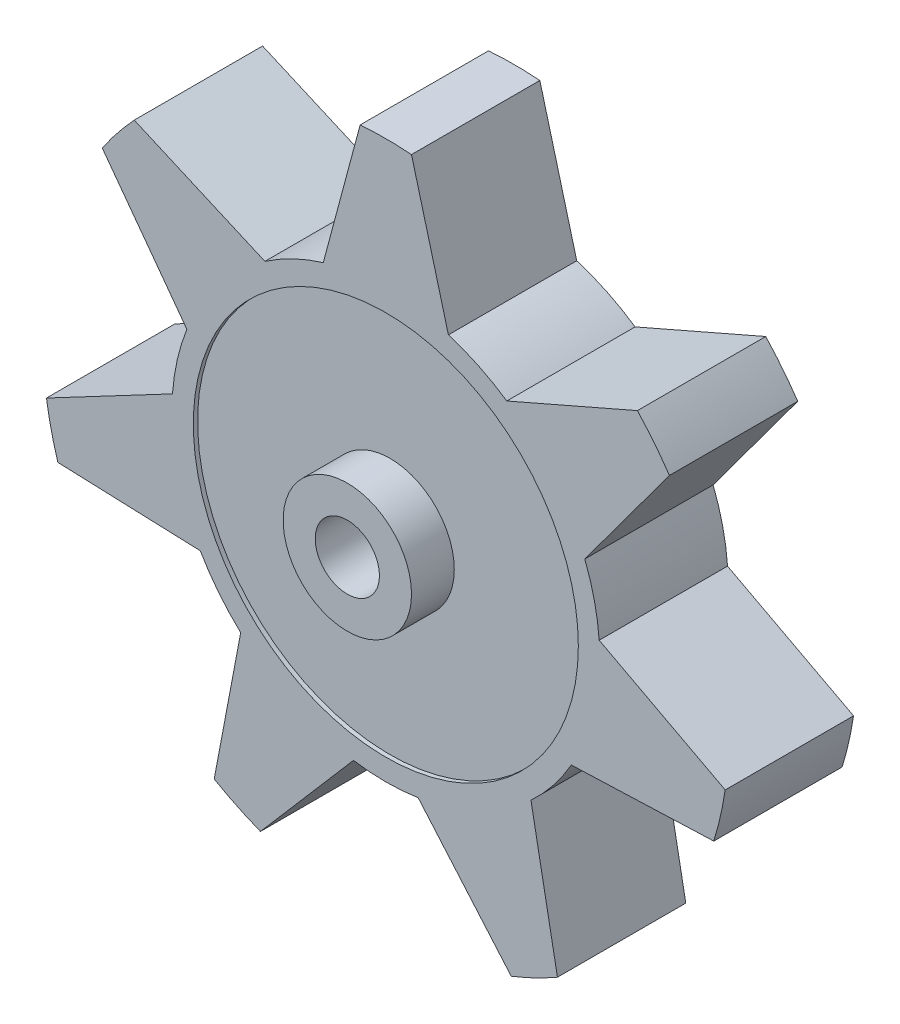
ISO-10303-21;
HEADER;
FILE_DESCRIPTION(('STEP AP214'),'2;1');
FILE_NAME('part.step','',(''),(''),'','','');
FILE_SCHEMA(('AUTOMOTIVE_DESIGN { 1 0 10303 214 1 1 1 1 }'));
ENDSEC;
DATA;
#1=APPLICATION_CONTEXT('core data for automotive mechanical design processes');
#2=APPLICATION_PROTOCOL_DEFINITION('international standard','automotive_design',2000,#1);
#3=PRODUCT_CONTEXT('',#1,'mechanical');
#4=PRODUCT('Part','Part','',(#3));
#5=PRODUCT_RELATED_PRODUCT_CATEGORY('part','',(#4));
#6=PRODUCT_DEFINITION_FORMATION('','',#4);
#7=PRODUCT_DEFINITION_CONTEXT('part definition',#1,'design');
#8=PRODUCT_DEFINITION('design','',#6,#7);
#9=PRODUCT_DEFINITION_SHAPE('','',#8);
#10=(LENGTH_UNIT() NAMED_UNIT(*) SI_UNIT(.MILLI.,.METRE.));
#11=(NAMED_UNIT(*) PLANE_ANGLE_UNIT() SI_UNIT($,.RADIAN.));
#12=(NAMED_UNIT(*) SI_UNIT($,.STERADIAN.) SOLID_ANGLE_UNIT());
#13=UNCERTAINTY_MEASURE_WITH_UNIT(LENGTH_MEASURE(1.E-05),#10,'distance_accuracy_value','');
#14=(GEOMETRIC_REPRESENTATION_CONTEXT(3) GLOBAL_UNCERTAINTY_ASSIGNED_CONTEXT((#13)) GLOBAL_UNIT_ASSIGNED_CONTEXT((#10,
#11,#12)) REPRESENTATION_CONTEXT('',''));
#15=CARTESIAN_POINT('',(0.,0.,0.));
#16=DIRECTION('',(0.,0.,1.));
#17=DIRECTION('',(1.,0.,0.));
#18=AXIS2_PLACEMENT_3D('',#15,#16,#17);
#19=CARTESIAN_POINT('',(0.,0.,3.));
#20=DIRECTION('',(0.,0.,-1.));
#21=DIRECTION('',(-1.,0.,0.));
#22=AXIS2_PLACEMENT_3D('',#19,#20,#21);
#23=CYLINDRICAL_SURFACE('',#22,5.);
#24=CARTESIAN_POINT('',(0.,0.,0.));
#25=DIRECTION('',(0.,0.,1.));
#26=DIRECTION('',(1.,0.,0.));
#27=AXIS2_PLACEMENT_3D('',#24,#25,#26);
#28=CIRCLE('',#27,5.);
#29=CARTESIAN_POINT('',(4.98689150508304,0.361819176565731,0.));
#30=VERTEX_POINT('',#29);
#31=CARTESIAN_POINT('',(4.65002145089957,1.83774331890333,0.));
#32=VERTEX_POINT('',#31);
#33=EDGE_CURVE('E413',#30,#32,#28,.T.);
#34=ORIENTED_EDGE('',*,*,#33,.T.);
#35=DIRECTION('',(0.,0.,1.));
#36=VECTOR('',#35,1.);
#37=CARTESIAN_POINT('',(4.65002145089958,1.83774331890332,-5.24947807928679));
#38=LINE('',#37,#36);
#39=CARTESIAN_POINT('',(4.65002145089957,1.83774331890333,3.));
#40=VERTEX_POINT('',#39);
#41=EDGE_CURVE('E60',#32,#40,#38,.T.);
#42=ORIENTED_EDGE('',*,*,#41,.T.);
#43=CARTESIAN_POINT('',(0.,0.,3.));
#44=DIRECTION('',(0.,0.,1.));
#45=DIRECTION('',(1.,0.,0.));
#46=AXIS2_PLACEMENT_3D('',#43,#44,#45);
#47=CIRCLE('',#46,5.);
#48=CARTESIAN_POINT('',(4.98689150508303,0.361819176565734,3.));
#49=VERTEX_POINT('',#48);
#50=EDGE_CURVE('E418',#49,#40,#47,.T.);
#51=ORIENTED_EDGE('',*,*,#50,.F.);
#52=DIRECTION('',(0.,0.,1.));
#53=VECTOR('',#52,1.);
#54=CARTESIAN_POINT('',(4.98689150508304,0.361819176565731,-4.59008523433716));
#55=LINE('',#54,#53);
#56=EDGE_CURVE('E280',#30,#49,#55,.T.);
#57=ORIENTED_EDGE('',*,*,#56,.F.);
#58=EDGE_LOOP('',(#34,#42,#51,#57));
#59=FACE_BOUND('',#58,.T.);
#60=ADVANCED_FACE('F36',(#59),#23,.T.);
#61=CARTESIAN_POINT('',(3.39215761959497,-3.67331821162064,0.));
#62=VERTEX_POINT('',#61);
#63=CARTESIAN_POINT('',(4.33604653647413,-2.48971894669472,0.));
#64=VERTEX_POINT('',#63);
#65=EDGE_CURVE('E414',#62,#64,#28,.T.);
#66=ORIENTED_EDGE('',*,*,#65,.T.);
#67=DIRECTION('',(0.,0.,1.));
#68=VECTOR('',#67,1.);
#69=CARTESIAN_POINT('',(4.33604653647413,-2.48971894669472,-4.59008523433716));
#70=LINE('',#69,#68);
#71=CARTESIAN_POINT('',(4.33604653647413,-2.48971894669472,3.));
#72=VERTEX_POINT('',#71);
#73=EDGE_CURVE('E278',#64,#72,#70,.T.);
#74=ORIENTED_EDGE('',*,*,#73,.T.);
#75=CARTESIAN_POINT('',(3.39215761959496,-3.67331821162064,3.));
#76=VERTEX_POINT('',#75);
#77=EDGE_CURVE('E441',#76,#72,#47,.T.);
#78=ORIENTED_EDGE('',*,*,#77,.F.);
#79=DIRECTION('',(0.,0.,1.));
#80=VECTOR('',#79,1.);
#81=CARTESIAN_POINT('',(3.39215761959497,-3.67331821162064,-4.99933698951545));
#82=LINE('',#81,#80);
#83=EDGE_CURVE('E305',#62,#76,#82,.T.);
#84=ORIENTED_EDGE('',*,*,#83,.F.);
#85=EDGE_LOOP('',(#66,#74,#78,#84));
#86=FACE_BOUND('',#85,.T.);
#87=ADVANCED_FACE('F429',(#86),#23,.T.);
#88=CARTESIAN_POINT('',(-0.756940140853331,-4.94237206442059,0.));
#89=VERTEX_POINT('',#88);
#90=CARTESIAN_POINT('',(0.756940140853422,-4.94237206442056,0.));
#91=VERTEX_POINT('',#90);
#92=EDGE_CURVE('E422',#89,#91,#28,.T.);
#93=ORIENTED_EDGE('',*,*,#92,.T.);
#94=DIRECTION('',(0.,0.,1.));
#95=VECTOR('',#94,1.);
#96=CARTESIAN_POINT('',(0.756940140853422,-4.94237206442057,-4.99933698951545));
#97=LINE('',#96,#95);
#98=CARTESIAN_POINT('',(0.756940140853422,-4.94237206442056,3.));
#99=VERTEX_POINT('',#98);
#100=EDGE_CURVE('E303',#91,#99,#97,.T.);
#101=ORIENTED_EDGE('',*,*,#100,.T.);
#102=CARTESIAN_POINT('',(-0.756940140853325,-4.94237206442058,3.));
#103=VERTEX_POINT('',#102);
#104=EDGE_CURVE('E443',#103,#99,#47,.T.);
#105=ORIENTED_EDGE('',*,*,#104,.F.);
#106=DIRECTION('',(0.,0.,1.));
#107=VECTOR('',#106,1.);
#108=CARTESIAN_POINT('',(-0.756940140853331,-4.94237206442059,-4.99933698951543));
#109=LINE('',#108,#107);
#110=EDGE_CURVE('E330',#89,#103,#109,.T.);
#111=ORIENTED_EDGE('',*,*,#110,.F.);
#112=EDGE_LOOP('',(#93,#101,#105,#111));
#113=FACE_BOUND('',#112,.T.);
#114=ADVANCED_FACE('F512',(#113),#23,.T.);
#115=CARTESIAN_POINT('',(-4.33604653647409,-2.4897189466948,0.));
#116=VERTEX_POINT('',#115);
#117=CARTESIAN_POINT('',(-3.39215761959489,-3.6733182116207,0.));
#118=VERTEX_POINT('',#117);
#119=EDGE_CURVE('E419',#116,#118,#28,.T.);
#120=ORIENTED_EDGE('',*,*,#119,.T.);
#121=DIRECTION('',(0.,0.,1.));
#122=VECTOR('',#121,1.);
#123=CARTESIAN_POINT('',(-3.39215761959489,-3.6733182116207,-4.99933698951543));
#124=LINE('',#123,#122);
#125=CARTESIAN_POINT('',(-3.39215761959489,-3.6733182116207,3.));
#126=VERTEX_POINT('',#125);
#127=EDGE_CURVE('E328',#118,#126,#124,.T.);
#128=ORIENTED_EDGE('',*,*,#127,.T.);
#129=CARTESIAN_POINT('',(-4.33604653647409,-2.4897189466948,3.));
#130=VERTEX_POINT('',#129);
#131=EDGE_CURVE('E445',#130,#126,#47,.T.);
#132=ORIENTED_EDGE('',*,*,#131,.F.);
#133=DIRECTION('',(0.,0.,1.));
#134=VECTOR('',#133,1.);
#135=CARTESIAN_POINT('',(-4.33604653647409,-2.4897189466948,-4.59008523433717));
#136=LINE('',#135,#134);
#137=EDGE_CURVE('E355',#116,#130,#136,.T.);
#138=ORIENTED_EDGE('',*,*,#137,.F.);
#139=EDGE_LOOP('',(#120,#128,#132,#138));
#140=FACE_BOUND('',#139,.T.);
#141=ADVANCED_FACE('F629',(#140),#23,.T.);
#142=CARTESIAN_POINT('',(-4.65002145089962,1.83774331890324,0.));
#143=VERTEX_POINT('',#142);
#144=CARTESIAN_POINT('',(-4.98689150508304,0.361819176565637,0.));
#145=VERTEX_POINT('',#144);
#146=EDGE_CURVE('E415',#143,#145,#28,.T.);
#147=ORIENTED_EDGE('',*,*,#146,.T.);
#148=DIRECTION('',(0.,0.,1.));
#149=VECTOR('',#148,1.);
#150=CARTESIAN_POINT('',(-4.98689150508304,0.36181917656564,-4.59008523433717));
#151=LINE('',#150,#149);
#152=CARTESIAN_POINT('',(-4.98689150508304,0.361819176565637,3.));
#153=VERTEX_POINT('',#152);
#154=EDGE_CURVE('E353',#145,#153,#151,.T.);
#155=ORIENTED_EDGE('',*,*,#154,.T.);
#156=CARTESIAN_POINT('',(-4.65002145089961,1.83774331890323,3.));
#157=VERTEX_POINT('',#156);
#158=EDGE_CURVE('E45',#157,#153,#47,.T.);
#159=ORIENTED_EDGE('',*,*,#158,.F.);
#160=DIRECTION('',(0.,0.,1.));
#161=VECTOR('',#160,1.);
#162=CARTESIAN_POINT('',(-4.65002145089962,1.83774331890324,-5.24947807928678));
#163=LINE('',#162,#161);
#164=EDGE_CURVE('E380',#143,#157,#163,.T.);
#165=ORIENTED_EDGE('',*,*,#164,.F.);
#166=EDGE_LOOP('',(#147,#155,#159,#165));
#167=FACE_BOUND('',#166,.T.);
#168=ADVANCED_FACE('F607',(#167),#23,.T.);
#169=CARTESIAN_POINT('',(-1.46243536964642,4.78134738223518,0.));
#170=VERTEX_POINT('',#169);
#171=CARTESIAN_POINT('',(-2.82639437319555,4.1244993450319,0.));
#172=VERTEX_POINT('',#171);
#173=EDGE_CURVE('E40',#170,#172,#28,.T.);
#174=ORIENTED_EDGE('',*,*,#173,.T.);
#175=DIRECTION('',(0.,0.,1.));
#176=VECTOR('',#175,1.);
#177=CARTESIAN_POINT('',(-2.82639437319554,4.1244993450319,-5.24947807928678));
#178=LINE('',#177,#176);
#179=CARTESIAN_POINT('',(-2.82639437319555,4.1244993450319,3.));
#180=VERTEX_POINT('',#179);
#181=EDGE_CURVE('E378',#172,#180,#178,.T.);
#182=ORIENTED_EDGE('',*,*,#181,.T.);
#183=CARTESIAN_POINT('',(-1.46243536964642,4.78134738223517,3.));
#184=VERTEX_POINT('',#183);
#185=EDGE_CURVE('E11',#184,#180,#47,.T.);
#186=ORIENTED_EDGE('',*,*,#185,.F.);
#187=DIRECTION('',(0.,0.,1.));
#188=VECTOR('',#187,1.);
#189=CARTESIAN_POINT('',(-1.46243536964642,4.78134738223518,-4.36574559552626));
#190=LINE('',#189,#188);
#191=EDGE_CURVE('E405',#170,#184,#190,.T.);
#192=ORIENTED_EDGE('',*,*,#191,.F.);
#193=EDGE_LOOP('',(#174,#182,#186,#192));
#194=FACE_BOUND('',#193,.T.);
#195=ADVANCED_FACE('F506',(#194),#23,.T.);
#196=CARTESIAN_POINT('',(2.82639437319546,4.12449934503196,3.));
#197=VERTEX_POINT('',#196);
#198=CARTESIAN_POINT('',(1.46243536964639,4.78134738223518,3.));
#199=VERTEX_POINT('',#198);
#200=EDGE_CURVE('E46',#197,#199,#47,.T.);
#201=ORIENTED_EDGE('',*,*,#200,.F.);
#202=DIRECTION('',(0.,0.,1.));
#203=VECTOR('',#202,1.);
#204=CARTESIAN_POINT('',(2.82639437319547,4.12449934503196,-5.24947807928679));
#205=LINE('',#204,#203);
#206=CARTESIAN_POINT('',(2.82639437319547,4.12449934503196,0.));
#207=VERTEX_POINT('',#206);
#208=EDGE_CURVE('E234',#207,#197,#205,.T.);
#209=ORIENTED_EDGE('',*,*,#208,.F.);
#210=CARTESIAN_POINT('',(1.46243536964639,4.78134738223518,0.));
#211=VERTEX_POINT('',#210);
#212=EDGE_CURVE('E409',#207,#211,#28,.T.);
#213=ORIENTED_EDGE('',*,*,#212,.T.);
#214=DIRECTION('',(0.,0.,1.));
#215=VECTOR('',#214,1.);
#216=CARTESIAN_POINT('',(1.46243536964639,4.78134738223518,-4.36574559552626));
#217=LINE('',#216,#215);
#218=EDGE_CURVE('E403',#211,#199,#217,.T.);
#219=ORIENTED_EDGE('',*,*,#218,.T.);
#220=EDGE_LOOP('',(#201,#209,#213,#219));
#221=FACE_BOUND('',#220,.T.);
#222=ADVANCED_FACE('F38',(#221),#23,.T.);
#223=CARTESIAN_POINT('',(0.,0.,3.));
#224=DIRECTION('',(0.,0.,1.));
#225=DIRECTION('',(1.,0.,0.));
#226=AXIS2_PLACEMENT_3D('',#223,#224,#225);
#227=PLANE('',#226);
#228=CARTESIAN_POINT('',(0.,0.,3.));
#229=DIRECTION('',(0.,0.,1.));
#230=DIRECTION('',(1.,0.,0.));
#231=AXIS2_PLACEMENT_3D('',#228,#229,#230);
#232=CIRCLE('',#231,4.5);
#233=CARTESIAN_POINT('',(4.5,0.,3.));
#234=VERTEX_POINT('',#233);
#235=EDGE_CURVE('E247',#234,#234,#232,.T.);
#236=ORIENTED_EDGE('',*,*,#235,.F.);
#237=EDGE_LOOP('',(#236));
#238=FACE_BOUND('',#237,.T.);
#239=ORIENTED_EDGE('',*,*,#50,.T.);
#240=DIRECTION('',(0.593820185573494,0.804597779766674,0.));
#241=VECTOR('',#240,1.);
#242=CARTESIAN_POINT('',(6.62874574085942,4.51881952538913,3.));
#243=LINE('',#242,#241);
#244=CARTESIAN_POINT('',(6.62874574085942,4.51881952538913,3.));
#245=VERTEX_POINT('',#244);
#246=EDGE_CURVE('E235',#40,#245,#243,.T.);
#247=ORIENTED_EDGE('',*,*,#246,.T.);
#248=CARTESIAN_POINT('',(0.,0.,3.));
#249=DIRECTION('',(0.,0.,1.));
#250=DIRECTION('',(-0.623489801858743,0.781831482468022,0.));
#251=AXIS2_PLACEMENT_3D('',#248,#249,#250);
#252=CIRCLE('',#251,8.02246844805263);
#253=CARTESIAN_POINT('',(5.88055797862893,5.45701730435076,3.));
#254=VERTEX_POINT('',#253);
#255=EDGE_CURVE('E229',#245,#254,#252,.T.);
#256=ORIENTED_EDGE('',*,*,#255,.T.);
#257=DIRECTION('',(-0.916562255869973,-0.399892024319749,0.));
#258=VECTOR('',#257,1.);
#259=CARTESIAN_POINT('',(5.88055797862893,5.45701730435076,3.));
#260=LINE('',#259,#258);
#261=EDGE_CURVE('E238',#254,#197,#260,.T.);
#262=ORIENTED_EDGE('',*,*,#261,.T.);
#263=ORIENTED_EDGE('',*,*,#200,.T.);
#264=DIRECTION('',(-0.258819045102518,0.965925826289069,0.));
#265=VECTOR('',#264,1.);
#266=CARTESIAN_POINT('',(0.6,8.,3.));
#267=LINE('',#266,#265);
#268=CARTESIAN_POINT('',(0.6,8.,3.));
#269=VERTEX_POINT('',#268);
#270=EDGE_CURVE('E398',#199,#269,#267,.T.);
#271=ORIENTED_EDGE('',*,*,#270,.T.);
#272=CARTESIAN_POINT('',(0.,0.,3.));
#273=DIRECTION('',(0.,0.,1.));
#274=DIRECTION('',(-1.,0.,0.));
#275=AXIS2_PLACEMENT_3D('',#272,#273,#274);
#276=CIRCLE('',#275,8.02246844805263);
#277=CARTESIAN_POINT('',(-0.6,8.,3.));
#278=VERTEX_POINT('',#277);
#279=EDGE_CURVE('E385',#269,#278,#276,.T.);
#280=ORIENTED_EDGE('',*,*,#279,.T.);
#281=DIRECTION('',(-0.258819045102525,-0.965925826289067,0.));
#282=VECTOR('',#281,1.);
#283=CARTESIAN_POINT('',(-0.6,8.,3.));
#284=LINE('',#283,#282);
#285=EDGE_CURVE('E395',#278,#184,#284,.T.);
#286=ORIENTED_EDGE('',*,*,#285,.T.);
#287=ORIENTED_EDGE('',*,*,#185,.T.);
#288=DIRECTION('',(-0.916562255869976,0.399892024319742,0.));
#289=VECTOR('',#288,1.);
#290=CARTESIAN_POINT('',(-5.88055797862901,5.45701730435067,3.));
#291=LINE('',#290,#289);
#292=CARTESIAN_POINT('',(-5.88055797862901,5.45701730435067,3.));
#293=VERTEX_POINT('',#292);
#294=EDGE_CURVE('E373',#180,#293,#291,.T.);
#295=ORIENTED_EDGE('',*,*,#294,.T.);
#296=CARTESIAN_POINT('',(0.,0.,3.));
#297=DIRECTION('',(0.,0.,1.));
#298=DIRECTION('',(-0.623489801858732,-0.781831482468031,0.));
#299=AXIS2_PLACEMENT_3D('',#296,#297,#298);
#300=CIRCLE('',#299,8.02246844805263);
#301=CARTESIAN_POINT('',(-6.62874574085949,4.51881952538904,3.));
#302=VERTEX_POINT('',#301);
#303=EDGE_CURVE('E360',#293,#302,#300,.T.);
#304=ORIENTED_EDGE('',*,*,#303,.T.);
#305=DIRECTION('',(0.5938201855735,-0.80459777976667,0.));
#306=VECTOR('',#305,1.);
#307=CARTESIAN_POINT('',(-6.62874574085949,4.51881952538904,3.));
#308=LINE('',#307,#306);
#309=EDGE_CURVE('E370',#302,#157,#308,.T.);
#310=ORIENTED_EDGE('',*,*,#309,.T.);
#311=ORIENTED_EDGE('',*,*,#158,.T.);
#312=DIRECTION('',(-0.884115393504609,-0.467268628273063,0.));
#313=VECTOR('',#312,1.);
#314=CARTESIAN_POINT('',(-7.93293585782837,-1.19521072434145,3.));
#315=LINE('',#314,#313);
#316=CARTESIAN_POINT('',(-7.93293585782837,-1.19521072434145,3.));
#317=VERTEX_POINT('',#316);
#318=EDGE_CURVE('E348',#153,#317,#315,.T.);
#319=ORIENTED_EDGE('',*,*,#318,.T.);
#320=CARTESIAN_POINT('',(0.,0.,3.));
#321=DIRECTION('',(0.,0.,1.));
#322=DIRECTION('',(0.222520933956318,-0.974927912181823,0.));
#323=AXIS2_PLACEMENT_3D('',#320,#321,#322);
#324=CIRCLE('',#323,8.02246844805263);
#325=CARTESIAN_POINT('',(-7.66591073708079,-2.36512421895964,3.));
#326=VERTEX_POINT('',#325);
#327=EDGE_CURVE('E335',#317,#326,#324,.T.);
#328=ORIENTED_EDGE('',*,*,#327,.T.);
#329=DIRECTION('',(0.999300704788399,-0.0373911942763257,0.));
#330=VECTOR('',#329,1.);
#331=CARTESIAN_POINT('',(-7.66591073708079,-2.36512421895964,3.));
#332=LINE('',#331,#330);
#333=EDGE_CURVE('E345',#326,#130,#332,.T.);
#334=ORIENTED_EDGE('',*,*,#333,.T.);
#335=ORIENTED_EDGE('',*,*,#131,.T.);
#336=DIRECTION('',(-0.185911607162911,-0.982566473233289,0.));
#337=VECTOR('',#336,1.);
#338=CARTESIAN_POINT('',(-4.01165123368187,-6.94742069974884,3.));
#339=LINE('',#338,#337);
#340=CARTESIAN_POINT('',(-4.01165123368187,-6.94742069974884,3.));
#341=VERTEX_POINT('',#340);
#342=EDGE_CURVE('E323',#126,#341,#339,.T.);
#343=ORIENTED_EDGE('',*,*,#342,.T.);
#344=CARTESIAN_POINT('',(0.,0.,3.));
#345=DIRECTION('',(0.,0.,1.));
#346=DIRECTION('',(0.900968867902422,-0.433883739117553,0.));
#347=AXIS2_PLACEMENT_3D('',#344,#345,#346);
#348=CIRCLE('',#347,8.02246844805263);
#349=CARTESIAN_POINT('',(-2.93048859219897,-7.46808118668991,3.));
#350=VERTEX_POINT('',#349);
#351=EDGE_CURVE('E310',#341,#350,#348,.T.);
#352=ORIENTED_EDGE('',*,*,#351,.T.);
#353=DIRECTION('',(0.65228741127812,0.757971723145454,0.));
#354=VECTOR('',#353,1.);
#355=CARTESIAN_POINT('',(-2.93048859219897,-7.46808118668991,3.));
#356=LINE('',#355,#354);
#357=EDGE_CURVE('E320',#350,#103,#356,.T.);
#358=ORIENTED_EDGE('',*,*,#357,.T.);
#359=ORIENTED_EDGE('',*,*,#104,.T.);
#360=DIRECTION('',(0.652287411278125,-0.757971723145449,0.));
#361=VECTOR('',#360,1.);
#362=CARTESIAN_POINT('',(2.93048859219907,-7.46808118668987,3.));
#363=LINE('',#362,#361);
#364=CARTESIAN_POINT('',(2.93048859219907,-7.46808118668987,3.));
#365=VERTEX_POINT('',#364);
#366=EDGE_CURVE('E298',#99,#365,#363,.T.);
#367=ORIENTED_EDGE('',*,*,#366,.T.);
#368=CARTESIAN_POINT('',(0.,0.,3.));
#369=DIRECTION('',(0.,0.,1.));
#370=DIRECTION('',(0.900968867902416,0.433883739117565,0.));
#371=AXIS2_PLACEMENT_3D('',#368,#369,#370);
#372=CIRCLE('',#371,8.02246844805263);
#373=CARTESIAN_POINT('',(4.01165123368197,-6.94742069974879,3.));
#374=VERTEX_POINT('',#373);
#375=EDGE_CURVE('E285',#365,#374,#372,.T.);
#376=ORIENTED_EDGE('',*,*,#375,.T.);
#377=DIRECTION('',(-0.185911607162918,0.982566473233287,0.));
#378=VECTOR('',#377,1.);
#379=CARTESIAN_POINT('',(4.01165123368197,-6.94742069974879,3.));
#380=LINE('',#379,#378);
#381=EDGE_CURVE('E295',#374,#76,#380,.T.);
#382=ORIENTED_EDGE('',*,*,#381,.T.);
#383=ORIENTED_EDGE('',*,*,#77,.T.);
#384=DIRECTION('',(0.999300704788398,0.0373911942763325,0.));
#385=VECTOR('',#384,1.);
#386=CARTESIAN_POINT('',(7.66591073708082,-2.36512421895954,3.));
#387=LINE('',#386,#385);
#388=CARTESIAN_POINT('',(7.66591073708082,-2.36512421895954,3.));
#389=VERTEX_POINT('',#388);
#390=EDGE_CURVE('E273',#72,#389,#387,.T.);
#391=ORIENTED_EDGE('',*,*,#390,.T.);
#392=CARTESIAN_POINT('',(0.,0.,3.));
#393=DIRECTION('',(0.,0.,1.));
#394=DIRECTION('',(0.222520933956305,0.974927912181826,0.));
#395=AXIS2_PLACEMENT_3D('',#392,#393,#394);
#396=CIRCLE('',#395,8.02246844805263);
#397=CARTESIAN_POINT('',(7.93293585782839,-1.19521072434134,3.));
#398=VERTEX_POINT('',#397);
#399=EDGE_CURVE('E260',#389,#398,#396,.T.);
#400=ORIENTED_EDGE('',*,*,#399,.T.);
#401=DIRECTION('',(-0.884115393504612,0.467268628273057,0.));
#402=VECTOR('',#401,1.);
#403=CARTESIAN_POINT('',(7.93293585782839,-1.19521072434134,3.));
#404=LINE('',#403,#402);
#405=EDGE_CURVE('E270',#398,#49,#404,.T.);
#406=ORIENTED_EDGE('',*,*,#405,.T.);
#407=EDGE_LOOP('',(#239,#247,#256,#262,#263,#271,#280,#286,#287,#295,#304,#310,#311,#319,#328,
#334,#335,#343,#352,#358,#359,#367,#376,#382,#383,#391,#400,#406));
#408=FACE_BOUND('',#407,.T.);
#409=ADVANCED_FACE('F242',(#238,#408),#227,.T.);
#410=CARTESIAN_POINT('',(0.,0.,0.));
#411=DIRECTION('',(0.,0.,1.));
#412=DIRECTION('',(1.,0.,0.));
#413=AXIS2_PLACEMENT_3D('',#410,#411,#412);
#414=PLANE('',#413);
#415=CARTESIAN_POINT('',(0.,0.,0.));
#416=DIRECTION('',(0.,0.,1.));
#417=DIRECTION('',(1.,0.,0.));
#418=AXIS2_PLACEMENT_3D('',#415,#416,#417);
#419=CIRCLE('',#418,0.75);
#420=CARTESIAN_POINT('',(0.75,0.,0.));
#421=VERTEX_POINT('',#420);
#422=EDGE_CURVE('E459',#421,#421,#419,.T.);
#423=ORIENTED_EDGE('',*,*,#422,.T.);
#424=EDGE_LOOP('',(#423));
#425=FACE_BOUND('',#424,.T.);
#426=ORIENTED_EDGE('',*,*,#212,.F.);
#427=DIRECTION('',(0.916562255869973,0.399892024319749,0.));
#428=VECTOR('',#427,1.);
#429=CARTESIAN_POINT('',(5.88055797862893,5.45701730435076,0.));
#430=LINE('',#429,#428);
#431=CARTESIAN_POINT('',(5.88055797862893,5.45701730435076,0.));
#432=VERTEX_POINT('',#431);
#433=EDGE_CURVE('E258',#207,#432,#430,.T.);
#434=ORIENTED_EDGE('',*,*,#433,.T.);
#435=CARTESIAN_POINT('',(0.,0.,0.));
#436=DIRECTION('',(0.,0.,1.));
#437=DIRECTION('',(1.,0.,0.));
#438=AXIS2_PLACEMENT_3D('',#435,#436,#437);
#439=CIRCLE('',#438,8.02246844805263);
#440=CARTESIAN_POINT('',(6.62874574085942,4.51881952538913,0.));
#441=VERTEX_POINT('',#440);
#442=EDGE_CURVE('E231',#432,#441,#439,.F.);
#443=ORIENTED_EDGE('',*,*,#442,.T.);
#444=DIRECTION('',(-0.593820185573494,-0.804597779766674,0.));
#445=VECTOR('',#444,1.);
#446=CARTESIAN_POINT('',(6.62874574085942,4.51881952538913,0.));
#447=LINE('',#446,#445);
#448=EDGE_CURVE('E255',#441,#32,#447,.T.);
#449=ORIENTED_EDGE('',*,*,#448,.T.);
#450=ORIENTED_EDGE('',*,*,#33,.F.);
#451=DIRECTION('',(0.884115393504612,-0.467268628273057,0.));
#452=VECTOR('',#451,1.);
#453=CARTESIAN_POINT('',(7.93293585782839,-1.19521072434134,0.));
#454=LINE('',#453,#452);
#455=CARTESIAN_POINT('',(7.93293585782839,-1.19521072434134,0.));
#456=VERTEX_POINT('',#455);
#457=EDGE_CURVE('E267',#30,#456,#454,.T.);
#458=ORIENTED_EDGE('',*,*,#457,.T.);
#459=CARTESIAN_POINT('',(0.,0.,0.));
#460=DIRECTION('',(0.,0.,1.));
#461=DIRECTION('',(1.,0.,0.));
#462=AXIS2_PLACEMENT_3D('',#459,#460,#461);
#463=CIRCLE('',#462,8.02246844805263);
#464=CARTESIAN_POINT('',(7.66591073708082,-2.36512421895954,0.));
#465=VERTEX_POINT('',#464);
#466=EDGE_CURVE('E264',#456,#465,#463,.F.);
#467=ORIENTED_EDGE('',*,*,#466,.T.);
#468=DIRECTION('',(-0.999300704788398,-0.0373911942763325,0.));
#469=VECTOR('',#468,1.);
#470=CARTESIAN_POINT('',(7.66591073708082,-2.36512421895954,0.));
#471=LINE('',#470,#469);
#472=EDGE_CURVE('E261',#465,#64,#471,.T.);
#473=ORIENTED_EDGE('',*,*,#472,.T.);
#474=ORIENTED_EDGE('',*,*,#65,.F.);
#475=DIRECTION('',(0.185911607162918,-0.982566473233288,0.));
#476=VECTOR('',#475,1.);
#477=CARTESIAN_POINT('',(4.01165123368197,-6.94742069974879,0.));
#478=LINE('',#477,#476);
#479=CARTESIAN_POINT('',(4.01165123368197,-6.94742069974879,0.));
#480=VERTEX_POINT('',#479);
#481=EDGE_CURVE('E292',#62,#480,#478,.T.);
#482=ORIENTED_EDGE('',*,*,#481,.T.);
#483=CARTESIAN_POINT('',(0.,0.,0.));
#484=DIRECTION('',(0.,0.,1.));
#485=DIRECTION('',(1.,0.,0.));
#486=AXIS2_PLACEMENT_3D('',#483,#484,#485);
#487=CIRCLE('',#486,8.02246844805263);
#488=CARTESIAN_POINT('',(2.93048859219907,-7.46808118668987,0.));
#489=VERTEX_POINT('',#488);
#490=EDGE_CURVE('E289',#480,#489,#487,.F.);
#491=ORIENTED_EDGE('',*,*,#490,.T.);
#492=DIRECTION('',(-0.652287411278125,0.75797172314545,0.));
#493=VECTOR('',#492,1.);
#494=CARTESIAN_POINT('',(2.93048859219907,-7.46808118668987,0.));
#495=LINE('',#494,#493);
#496=EDGE_CURVE('E286',#489,#91,#495,.T.);
#497=ORIENTED_EDGE('',*,*,#496,.T.);
#498=ORIENTED_EDGE('',*,*,#92,.F.);
#499=DIRECTION('',(-0.65228741127812,-0.757971723145454,0.));
#500=VECTOR('',#499,1.);
#501=CARTESIAN_POINT('',(-2.93048859219897,-7.46808118668991,0.));
#502=LINE('',#501,#500);
#503=CARTESIAN_POINT('',(-2.93048859219897,-7.46808118668991,0.));
#504=VERTEX_POINT('',#503);
#505=EDGE_CURVE('E317',#89,#504,#502,.T.);
#506=ORIENTED_EDGE('',*,*,#505,.T.);
#507=CARTESIAN_POINT('',(0.,0.,0.));
#508=DIRECTION('',(0.,0.,1.));
#509=DIRECTION('',(1.,0.,0.));
#510=AXIS2_PLACEMENT_3D('',#507,#508,#509);
#511=CIRCLE('',#510,8.02246844805263);
#512=CARTESIAN_POINT('',(-4.01165123368187,-6.94742069974884,0.));
#513=VERTEX_POINT('',#512);
#514=EDGE_CURVE('E314',#504,#513,#511,.F.);
#515=ORIENTED_EDGE('',*,*,#514,.T.);
#516=DIRECTION('',(0.185911607162911,0.982566473233289,0.));
#517=VECTOR('',#516,1.);
#518=CARTESIAN_POINT('',(-4.01165123368187,-6.94742069974884,0.));
#519=LINE('',#518,#517);
#520=EDGE_CURVE('E311',#513,#118,#519,.T.);
#521=ORIENTED_EDGE('',*,*,#520,.T.);
#522=ORIENTED_EDGE('',*,*,#119,.F.);
#523=DIRECTION('',(-0.999300704788399,0.0373911942763257,0.));
#524=VECTOR('',#523,1.);
#525=CARTESIAN_POINT('',(-7.66591073708079,-2.36512421895964,0.));
#526=LINE('',#525,#524);
#527=CARTESIAN_POINT('',(-7.66591073708079,-2.36512421895964,0.));
#528=VERTEX_POINT('',#527);
#529=EDGE_CURVE('E342',#116,#528,#526,.T.);
#530=ORIENTED_EDGE('',*,*,#529,.T.);
#531=CARTESIAN_POINT('',(0.,0.,0.));
#532=DIRECTION('',(0.,0.,1.));
#533=DIRECTION('',(1.,0.,0.));
#534=AXIS2_PLACEMENT_3D('',#531,#532,#533);
#535=CIRCLE('',#534,8.02246844805263);
#536=CARTESIAN_POINT('',(-7.93293585782837,-1.19521072434145,0.));
#537=VERTEX_POINT('',#536);
#538=EDGE_CURVE('E339',#528,#537,#535,.F.);
#539=ORIENTED_EDGE('',*,*,#538,.T.);
#540=DIRECTION('',(0.884115393504609,0.467268628273063,0.));
#541=VECTOR('',#540,1.);
#542=CARTESIAN_POINT('',(-7.93293585782837,-1.19521072434145,0.));
#543=LINE('',#542,#541);
#544=EDGE_CURVE('E336',#537,#145,#543,.T.);
#545=ORIENTED_EDGE('',*,*,#544,.T.);
#546=ORIENTED_EDGE('',*,*,#146,.F.);
#547=DIRECTION('',(-0.5938201855735,0.80459777976667,0.));
#548=VECTOR('',#547,1.);
#549=CARTESIAN_POINT('',(-6.62874574085949,4.51881952538904,0.));
#550=LINE('',#549,#548);
#551=CARTESIAN_POINT('',(-6.62874574085949,4.51881952538904,0.));
#552=VERTEX_POINT('',#551);
#553=EDGE_CURVE('E367',#143,#552,#550,.T.);
#554=ORIENTED_EDGE('',*,*,#553,.T.);
#555=CARTESIAN_POINT('',(0.,0.,0.));
#556=DIRECTION('',(0.,0.,1.));
#557=DIRECTION('',(1.,0.,0.));
#558=AXIS2_PLACEMENT_3D('',#555,#556,#557);
#559=CIRCLE('',#558,8.02246844805263);
#560=CARTESIAN_POINT('',(-5.88055797862901,5.45701730435067,0.));
#561=VERTEX_POINT('',#560);
#562=EDGE_CURVE('E364',#552,#561,#559,.F.);
#563=ORIENTED_EDGE('',*,*,#562,.T.);
#564=DIRECTION('',(0.916562255869976,-0.399892024319742,0.));
#565=VECTOR('',#564,1.);
#566=CARTESIAN_POINT('',(-5.88055797862901,5.45701730435067,0.));
#567=LINE('',#566,#565);
#568=EDGE_CURVE('E361',#561,#172,#567,.T.);
#569=ORIENTED_EDGE('',*,*,#568,.T.);
#570=ORIENTED_EDGE('',*,*,#173,.F.);
#571=DIRECTION('',(0.258819045102525,0.965925826289067,0.));
#572=VECTOR('',#571,1.);
#573=CARTESIAN_POINT('',(-0.6,8.,0.));
#574=LINE('',#573,#572);
#575=CARTESIAN_POINT('',(-0.6,8.,0.));
#576=VERTEX_POINT('',#575);
#577=EDGE_CURVE('E392',#170,#576,#574,.T.);
#578=ORIENTED_EDGE('',*,*,#577,.T.);
#579=CARTESIAN_POINT('',(0.,0.,0.));
#580=DIRECTION('',(0.,0.,1.));
#581=DIRECTION('',(1.,0.,0.));
#582=AXIS2_PLACEMENT_3D('',#579,#580,#581);
#583=CIRCLE('',#582,8.02246844805263);
#584=CARTESIAN_POINT('',(0.6,8.,0.));
#585=VERTEX_POINT('',#584);
#586=EDGE_CURVE('E389',#576,#585,#583,.F.);
#587=ORIENTED_EDGE('',*,*,#586,.T.);
#588=DIRECTION('',(0.258819045102518,-0.965925826289069,0.));
#589=VECTOR('',#588,1.);
#590=CARTESIAN_POINT('',(0.6,8.,0.));
#591=LINE('',#590,#589);
#592=EDGE_CURVE('E386',#585,#211,#591,.T.);
#593=ORIENTED_EDGE('',*,*,#592,.T.);
#594=EDGE_LOOP('',(#426,#434,#443,#449,#450,#458,#467,#473,#474,#482,#491,#497,#498,#506,#515,
#521,#522,#530,#539,#545,#546,#554,#563,#569,#570,#578,#587,#593));
#595=FACE_BOUND('',#594,.T.);
#596=ADVANCED_FACE('F434',(#425,#595),#414,.F.);
#597=CARTESIAN_POINT('',(0.,0.,-4.36574559552626));
#598=DIRECTION('',(0.,0.,1.));
#599=DIRECTION('',(1.,0.,0.));
#600=AXIS2_PLACEMENT_3D('',#597,#598,#599);
#601=CYLINDRICAL_SURFACE('',#600,8.02246844805263);
#602=ORIENTED_EDGE('',*,*,#586,.F.);
#603=DIRECTION('',(0.,0.,1.));
#604=VECTOR('',#603,1.);
#605=CARTESIAN_POINT('',(-0.6,8.,-4.36574559552626));
#606=LINE('',#605,#604);
#607=EDGE_CURVE('E401',#576,#278,#606,.T.);
#608=ORIENTED_EDGE('',*,*,#607,.T.);
#609=ORIENTED_EDGE('',*,*,#279,.F.);
#610=DIRECTION('',(0.,0.,1.));
#611=VECTOR('',#610,1.);
#612=CARTESIAN_POINT('',(0.6,8.,-4.36574559552626));
#613=LINE('',#612,#611);
#614=EDGE_CURVE('E390',#585,#269,#613,.T.);
#615=ORIENTED_EDGE('',*,*,#614,.F.);
#616=EDGE_LOOP('',(#602,#608,#609,#615));
#617=FACE_BOUND('',#616,.T.);
#618=ADVANCED_FACE('F505',(#617),#601,.T.);
#619=CARTESIAN_POINT('',(0.6,8.,-4.36574559552626));
#620=DIRECTION('',(0.965925826289069,0.258819045102518,0.));
#621=DIRECTION('',(-0.258819045102518,0.965925826289069,0.));
#622=AXIS2_PLACEMENT_3D('',#619,#620,#621);
#623=PLANE('',#622);
#624=ORIENTED_EDGE('',*,*,#592,.F.);
#625=ORIENTED_EDGE('',*,*,#614,.T.);
#626=ORIENTED_EDGE('',*,*,#270,.F.);
#627=ORIENTED_EDGE('',*,*,#218,.F.);
#628=EDGE_LOOP('',(#624,#625,#626,#627));
#629=FACE_BOUND('',#628,.T.);
#630=ADVANCED_FACE('F579',(#629),#623,.T.);
#631=CARTESIAN_POINT('',(-0.6,8.,-4.36574559552626));
#632=DIRECTION('',(-0.965925826289067,0.258819045102525,0.));
#633=DIRECTION('',(-0.258819045102525,-0.965925826289067,0.));
#634=AXIS2_PLACEMENT_3D('',#631,#632,#633);
#635=PLANE('',#634);
#636=ORIENTED_EDGE('',*,*,#577,.F.);
#637=ORIENTED_EDGE('',*,*,#191,.T.);
#638=ORIENTED_EDGE('',*,*,#285,.F.);
#639=ORIENTED_EDGE('',*,*,#607,.F.);
#640=EDGE_LOOP('',(#636,#637,#638,#639));
#641=FACE_BOUND('',#640,.T.);
#642=ADVANCED_FACE('F577',(#641),#635,.T.);
#643=CARTESIAN_POINT('',(0.,0.,-5.24947807928678));
#644=DIRECTION('',(0.,0.,1.));
#645=DIRECTION('',(1.,0.,0.));
#646=AXIS2_PLACEMENT_3D('',#643,#644,#645);
#647=CYLINDRICAL_SURFACE('',#646,8.02246844805263);
#648=ORIENTED_EDGE('',*,*,#562,.F.);
#649=DIRECTION('',(0.,0.,1.));
#650=VECTOR('',#649,1.);
#651=CARTESIAN_POINT('',(-6.62874574085949,4.51881952538904,-5.24947807928678));
#652=LINE('',#651,#650);
#653=EDGE_CURVE('E376',#552,#302,#652,.T.);
#654=ORIENTED_EDGE('',*,*,#653,.T.);
#655=ORIENTED_EDGE('',*,*,#303,.F.);
#656=DIRECTION('',(0.,0.,1.));
#657=VECTOR('',#656,1.);
#658=CARTESIAN_POINT('',(-5.88055797862901,5.45701730435067,-5.24947807928678));
#659=LINE('',#658,#657);
#660=EDGE_CURVE('E365',#561,#293,#659,.T.);
#661=ORIENTED_EDGE('',*,*,#660,.F.);
#662=EDGE_LOOP('',(#648,#654,#655,#661));
#663=FACE_BOUND('',#662,.T.);
#664=ADVANCED_FACE('F570',(#663),#647,.T.);
#665=CARTESIAN_POINT('',(-5.88055797862901,5.45701730435067,-5.24947807928678));
#666=DIRECTION('',(0.399892024319742,0.916562255869976,0.));
#667=DIRECTION('',(-0.916562255869976,0.399892024319742,0.));
#668=AXIS2_PLACEMENT_3D('',#665,#666,#667);
#669=PLANE('',#668);
#670=ORIENTED_EDGE('',*,*,#568,.F.);
#671=ORIENTED_EDGE('',*,*,#660,.T.);
#672=ORIENTED_EDGE('',*,*,#294,.F.);
#673=ORIENTED_EDGE('',*,*,#181,.F.);
#674=EDGE_LOOP('',(#670,#671,#672,#673));
#675=FACE_BOUND('',#674,.T.);
#676=ADVANCED_FACE('F567',(#675),#669,.T.);
#677=CARTESIAN_POINT('',(-6.62874574085949,4.51881952538904,-5.24947807928678));
#678=DIRECTION('',(-0.80459777976667,-0.5938201855735,0.));
#679=DIRECTION('',(0.5938201855735,-0.80459777976667,0.));
#680=AXIS2_PLACEMENT_3D('',#677,#678,#679);
#681=PLANE('',#680);
#682=ORIENTED_EDGE('',*,*,#553,.F.);
#683=ORIENTED_EDGE('',*,*,#164,.T.);
#684=ORIENTED_EDGE('',*,*,#309,.F.);
#685=ORIENTED_EDGE('',*,*,#653,.F.);
#686=EDGE_LOOP('',(#682,#683,#684,#685));
#687=FACE_BOUND('',#686,.T.);
#688=ADVANCED_FACE('F565',(#687),#681,.T.);
#689=CARTESIAN_POINT('',(0.,0.,-4.59008523433717));
#690=DIRECTION('',(0.,0.,1.));
#691=DIRECTION('',(1.,0.,0.));
#692=AXIS2_PLACEMENT_3D('',#689,#690,#691);
#693=CYLINDRICAL_SURFACE('',#692,8.02246844805263);
#694=ORIENTED_EDGE('',*,*,#538,.F.);
#695=DIRECTION('',(0.,0.,1.));
#696=VECTOR('',#695,1.);
#697=CARTESIAN_POINT('',(-7.66591073708079,-2.36512421895964,-4.59008523433717));
#698=LINE('',#697,#696);
#699=EDGE_CURVE('E351',#528,#326,#698,.T.);
#700=ORIENTED_EDGE('',*,*,#699,.T.);
#701=ORIENTED_EDGE('',*,*,#327,.F.);
#702=DIRECTION('',(0.,0.,1.));
#703=VECTOR('',#702,1.);
#704=CARTESIAN_POINT('',(-7.93293585782837,-1.19521072434145,-4.59008523433717));
#705=LINE('',#704,#703);
#706=EDGE_CURVE('E340',#537,#317,#705,.T.);
#707=ORIENTED_EDGE('',*,*,#706,.F.);
#708=EDGE_LOOP('',(#694,#700,#701,#707));
#709=FACE_BOUND('',#708,.T.);
#710=ADVANCED_FACE('F558',(#709),#693,.T.);
#711=CARTESIAN_POINT('',(-7.93293585782837,-1.19521072434145,-4.59008523433717));
#712=DIRECTION('',(-0.467268628273063,0.884115393504609,0.));
#713=DIRECTION('',(-0.884115393504609,-0.467268628273063,0.));
#714=AXIS2_PLACEMENT_3D('',#711,#712,#713);
#715=PLANE('',#714);
#716=ORIENTED_EDGE('',*,*,#544,.F.);
#717=ORIENTED_EDGE('',*,*,#706,.T.);
#718=ORIENTED_EDGE('',*,*,#318,.F.);
#719=ORIENTED_EDGE('',*,*,#154,.F.);
#720=EDGE_LOOP('',(#716,#717,#718,#719));
#721=FACE_BOUND('',#720,.T.);
#722=ADVANCED_FACE('F555',(#721),#715,.T.);
#723=CARTESIAN_POINT('',(-7.66591073708079,-2.36512421895964,-4.59008523433717));
#724=DIRECTION('',(-0.0373911942763257,-0.999300704788398,0.));
#725=DIRECTION('',(0.999300704788399,-0.0373911942763257,0.));
#726=AXIS2_PLACEMENT_3D('',#723,#724,#725);
#727=PLANE('',#726);
#728=ORIENTED_EDGE('',*,*,#529,.F.);
#729=ORIENTED_EDGE('',*,*,#137,.T.);
#730=ORIENTED_EDGE('',*,*,#333,.F.);
#731=ORIENTED_EDGE('',*,*,#699,.F.);
#732=EDGE_LOOP('',(#728,#729,#730,#731));
#733=FACE_BOUND('',#732,.T.);
#734=ADVANCED_FACE('F553',(#733),#727,.T.);
#735=CARTESIAN_POINT('',(0.,0.,-4.99933698951543));
#736=DIRECTION('',(0.,0.,1.));
#737=DIRECTION('',(1.,0.,0.));
#738=AXIS2_PLACEMENT_3D('',#735,#736,#737);
#739=CYLINDRICAL_SURFACE('',#738,8.02246844805263);
#740=ORIENTED_EDGE('',*,*,#514,.F.);
#741=DIRECTION('',(0.,0.,1.));
#742=VECTOR('',#741,1.);
#743=CARTESIAN_POINT('',(-2.93048859219897,-7.46808118668991,-4.99933698951543));
#744=LINE('',#743,#742);
#745=EDGE_CURVE('E326',#504,#350,#744,.T.);
#746=ORIENTED_EDGE('',*,*,#745,.T.);
#747=ORIENTED_EDGE('',*,*,#351,.F.);
#748=DIRECTION('',(0.,0.,1.));
#749=VECTOR('',#748,1.);
#750=CARTESIAN_POINT('',(-4.01165123368187,-6.94742069974884,-4.99933698951543));
#751=LINE('',#750,#749);
#752=EDGE_CURVE('E315',#513,#341,#751,.T.);
#753=ORIENTED_EDGE('',*,*,#752,.F.);
#754=EDGE_LOOP('',(#740,#746,#747,#753));
#755=FACE_BOUND('',#754,.T.);
#756=ADVANCED_FACE('F546',(#755),#739,.T.);
#757=CARTESIAN_POINT('',(-4.01165123368187,-6.94742069974884,-4.99933698951543));
#758=DIRECTION('',(-0.982566473233289,0.185911607162911,0.));
#759=DIRECTION('',(-0.185911607162911,-0.982566473233289,0.));
#760=AXIS2_PLACEMENT_3D('',#757,#758,#759);
#761=PLANE('',#760);
#762=ORIENTED_EDGE('',*,*,#520,.F.);
#763=ORIENTED_EDGE('',*,*,#752,.T.);
#764=ORIENTED_EDGE('',*,*,#342,.F.);
#765=ORIENTED_EDGE('',*,*,#127,.F.);
#766=EDGE_LOOP('',(#762,#763,#764,#765));
#767=FACE_BOUND('',#766,.T.);
#768=ADVANCED_FACE('F543',(#767),#761,.T.);
#769=CARTESIAN_POINT('',(-2.93048859219897,-7.46808118668991,-4.99933698951543));
#770=DIRECTION('',(0.757971723145454,-0.65228741127812,0.));
#771=DIRECTION('',(0.65228741127812,0.757971723145454,0.));
#772=AXIS2_PLACEMENT_3D('',#769,#770,#771);
#773=PLANE('',#772);
#774=ORIENTED_EDGE('',*,*,#505,.F.);
#775=ORIENTED_EDGE('',*,*,#110,.T.);
#776=ORIENTED_EDGE('',*,*,#357,.F.);
#777=ORIENTED_EDGE('',*,*,#745,.F.);
#778=EDGE_LOOP('',(#774,#775,#776,#777));
#779=FACE_BOUND('',#778,.T.);
#780=ADVANCED_FACE('F541',(#779),#773,.T.);
#781=CARTESIAN_POINT('',(0.,0.,-4.99933698951545));
#782=DIRECTION('',(0.,0.,1.));
#783=DIRECTION('',(1.,0.,0.));
#784=AXIS2_PLACEMENT_3D('',#781,#782,#783);
#785=CYLINDRICAL_SURFACE('',#784,8.02246844805263);
#786=ORIENTED_EDGE('',*,*,#490,.F.);
#787=DIRECTION('',(0.,0.,1.));
#788=VECTOR('',#787,1.);
#789=CARTESIAN_POINT('',(4.01165123368197,-6.94742069974879,-4.99933698951545));
#790=LINE('',#789,#788);
#791=EDGE_CURVE('E301',#480,#374,#790,.T.);
#792=ORIENTED_EDGE('',*,*,#791,.T.);
#793=ORIENTED_EDGE('',*,*,#375,.F.);
#794=DIRECTION('',(0.,0.,1.));
#795=VECTOR('',#794,1.);
#796=CARTESIAN_POINT('',(2.93048859219907,-7.46808118668987,-4.99933698951545));
#797=LINE('',#796,#795);
#798=EDGE_CURVE('E290',#489,#365,#797,.T.);
#799=ORIENTED_EDGE('',*,*,#798,.F.);
#800=EDGE_LOOP('',(#786,#792,#793,#799));
#801=FACE_BOUND('',#800,.T.);
#802=ADVANCED_FACE('F534',(#801),#785,.T.);
#803=CARTESIAN_POINT('',(2.93048859219907,-7.46808118668987,-4.99933698951545));
#804=DIRECTION('',(-0.75797172314545,-0.652287411278125,0.));
#805=DIRECTION('',(0.652287411278125,-0.75797172314545,0.));
#806=AXIS2_PLACEMENT_3D('',#803,#804,#805);
#807=PLANE('',#806);
#808=ORIENTED_EDGE('',*,*,#496,.F.);
#809=ORIENTED_EDGE('',*,*,#798,.T.);
#810=ORIENTED_EDGE('',*,*,#366,.F.);
#811=ORIENTED_EDGE('',*,*,#100,.F.);
#812=EDGE_LOOP('',(#808,#809,#810,#811));
#813=FACE_BOUND('',#812,.T.);
#814=ADVANCED_FACE('F531',(#813),#807,.T.);
#815=CARTESIAN_POINT('',(4.01165123368197,-6.94742069974879,-4.99933698951545));
#816=DIRECTION('',(0.982566473233288,0.185911607162918,0.));
#817=DIRECTION('',(-0.185911607162918,0.982566473233288,0.));
#818=AXIS2_PLACEMENT_3D('',#815,#816,#817);
#819=PLANE('',#818);
#820=ORIENTED_EDGE('',*,*,#481,.F.);
#821=ORIENTED_EDGE('',*,*,#83,.T.);
#822=ORIENTED_EDGE('',*,*,#381,.F.);
#823=ORIENTED_EDGE('',*,*,#791,.F.);
#824=EDGE_LOOP('',(#820,#821,#822,#823));
#825=FACE_BOUND('',#824,.T.);
#826=ADVANCED_FACE('F530',(#825),#819,.T.);
#827=CARTESIAN_POINT('',(0.,0.,-4.59008523433716));
#828=DIRECTION('',(0.,0.,1.));
#829=DIRECTION('',(1.,0.,0.));
#830=AXIS2_PLACEMENT_3D('',#827,#828,#829);
#831=CYLINDRICAL_SURFACE('',#830,8.02246844805263);
#832=ORIENTED_EDGE('',*,*,#466,.F.);
#833=DIRECTION('',(0.,0.,1.));
#834=VECTOR('',#833,1.);
#835=CARTESIAN_POINT('',(7.93293585782839,-1.19521072434134,-4.59008523433716));
#836=LINE('',#835,#834);
#837=EDGE_CURVE('E276',#456,#398,#836,.T.);
#838=ORIENTED_EDGE('',*,*,#837,.T.);
#839=ORIENTED_EDGE('',*,*,#399,.F.);
#840=DIRECTION('',(0.,0.,1.));
#841=VECTOR('',#840,1.);
#842=CARTESIAN_POINT('',(7.66591073708082,-2.36512421895954,-4.59008523433716));
#843=LINE('',#842,#841);
#844=EDGE_CURVE('E265',#465,#389,#843,.T.);
#845=ORIENTED_EDGE('',*,*,#844,.F.);
#846=EDGE_LOOP('',(#832,#838,#839,#845));
#847=FACE_BOUND('',#846,.T.);
#848=ADVANCED_FACE('F517',(#847),#831,.T.);
#849=CARTESIAN_POINT('',(7.66591073708082,-2.36512421895954,-4.59008523433716));
#850=DIRECTION('',(0.0373911942763325,-0.999300704788398,0.));
#851=DIRECTION('',(0.999300704788398,0.0373911942763325,0.));
#852=AXIS2_PLACEMENT_3D('',#849,#850,#851);
#853=PLANE('',#852);
#854=ORIENTED_EDGE('',*,*,#472,.F.);
#855=ORIENTED_EDGE('',*,*,#844,.T.);
#856=ORIENTED_EDGE('',*,*,#390,.F.);
#857=ORIENTED_EDGE('',*,*,#73,.F.);
#858=EDGE_LOOP('',(#854,#855,#856,#857));
#859=FACE_BOUND('',#858,.T.);
#860=ADVANCED_FACE('F439',(#859),#853,.T.);
#861=CARTESIAN_POINT('',(7.93293585782839,-1.19521072434134,-4.59008523433716));
#862=DIRECTION('',(0.467268628273057,0.884115393504612,0.));
#863=DIRECTION('',(-0.884115393504612,0.467268628273057,0.));
#864=AXIS2_PLACEMENT_3D('',#861,#862,#863);
#865=PLANE('',#864);
#866=ORIENTED_EDGE('',*,*,#457,.F.);
#867=ORIENTED_EDGE('',*,*,#56,.T.);
#868=ORIENTED_EDGE('',*,*,#405,.F.);
#869=ORIENTED_EDGE('',*,*,#837,.F.);
#870=EDGE_LOOP('',(#866,#867,#868,#869));
#871=FACE_BOUND('',#870,.T.);
#872=ADVANCED_FACE('F518',(#871),#865,.T.);
#873=CARTESIAN_POINT('',(0.,0.,-5.24947807928679));
#874=DIRECTION('',(0.,0.,1.));
#875=DIRECTION('',(1.,0.,0.));
#876=AXIS2_PLACEMENT_3D('',#873,#874,#875);
#877=CYLINDRICAL_SURFACE('',#876,8.02246844805263);
#878=ORIENTED_EDGE('',*,*,#442,.F.);
#879=DIRECTION('',(0.,0.,1.));
#880=VECTOR('',#879,1.);
#881=CARTESIAN_POINT('',(5.88055797862893,5.45701730435076,-5.24947807928679));
#882=LINE('',#881,#880);
#883=EDGE_CURVE('E224',#432,#254,#882,.T.);
#884=ORIENTED_EDGE('',*,*,#883,.T.);
#885=ORIENTED_EDGE('',*,*,#255,.F.);
#886=DIRECTION('',(0.,0.,1.));
#887=VECTOR('',#886,1.);
#888=CARTESIAN_POINT('',(6.62874574085942,4.51881952538913,-5.24947807928679));
#889=LINE('',#888,#887);
#890=EDGE_CURVE('E253',#441,#245,#889,.T.);
#891=ORIENTED_EDGE('',*,*,#890,.F.);
#892=EDGE_LOOP('',(#878,#884,#885,#891));
#893=FACE_BOUND('',#892,.T.);
#894=ADVANCED_FACE('F226',(#893),#877,.T.);
#895=CARTESIAN_POINT('',(6.62874574085942,4.51881952538913,-5.24947807928679));
#896=DIRECTION('',(0.804597779766674,-0.593820185573494,0.));
#897=DIRECTION('',(0.593820185573494,0.804597779766674,0.));
#898=AXIS2_PLACEMENT_3D('',#895,#896,#897);
#899=PLANE('',#898);
#900=ORIENTED_EDGE('',*,*,#448,.F.);
#901=ORIENTED_EDGE('',*,*,#890,.T.);
#902=ORIENTED_EDGE('',*,*,#246,.F.);
#903=ORIENTED_EDGE('',*,*,#41,.F.);
#904=EDGE_LOOP('',(#900,#901,#902,#903));
#905=FACE_BOUND('',#904,.T.);
#906=ADVANCED_FACE('F450',(#905),#899,.T.);
#907=CARTESIAN_POINT('',(5.88055797862893,5.45701730435076,-5.24947807928679));
#908=DIRECTION('',(-0.399892024319749,0.916562255869973,0.));
#909=DIRECTION('',(-0.916562255869973,-0.399892024319749,0.));
#910=AXIS2_PLACEMENT_3D('',#907,#908,#909);
#911=PLANE('',#910);
#912=ORIENTED_EDGE('',*,*,#433,.F.);
#913=ORIENTED_EDGE('',*,*,#208,.T.);
#914=ORIENTED_EDGE('',*,*,#261,.F.);
#915=ORIENTED_EDGE('',*,*,#883,.F.);
#916=EDGE_LOOP('',(#912,#913,#914,#915));
#917=FACE_BOUND('',#916,.T.);
#918=ADVANCED_FACE('F239',(#917),#911,.T.);
#919=CARTESIAN_POINT('',(0.,0.,2.9));
#920=DIRECTION('',(0.,0.,1.));
#921=DIRECTION('',(1.,0.,0.));
#922=AXIS2_PLACEMENT_3D('',#919,#920,#921);
#923=CYLINDRICAL_SURFACE('',#922,4.5);
#924=CARTESIAN_POINT('',(0.,0.,2.9));
#925=DIRECTION('',(0.,0.,1.));
#926=DIRECTION('',(1.,0.,0.));
#927=AXIS2_PLACEMENT_3D('',#924,#925,#926);
#928=CIRCLE('',#927,4.5);
#929=CARTESIAN_POINT('',(4.5,0.,2.9));
#930=VERTEX_POINT('',#929);
#931=EDGE_CURVE('E244',#930,#930,#928,.T.);
#932=ORIENTED_EDGE('',*,*,#931,.F.);
#933=EDGE_LOOP('',(#932));
#934=FACE_BOUND('',#933,.T.);
#935=ORIENTED_EDGE('',*,*,#235,.T.);
#936=EDGE_LOOP('',(#935));
#937=FACE_BOUND('',#936,.T.);
#938=ADVANCED_FACE('F490',(#934,#937),#923,.F.);
#939=CARTESIAN_POINT('',(0.,0.,2.9));
#940=DIRECTION('',(0.,0.,1.));
#941=DIRECTION('',(1.,0.,0.));
#942=AXIS2_PLACEMENT_3D('',#939,#940,#941);
#943=PLANE('',#942);
#944=CARTESIAN_POINT('',(0.,0.,2.9));
#945=DIRECTION('',(0.,0.,1.));
#946=DIRECTION('',(1.,0.,0.));
#947=AXIS2_PLACEMENT_3D('',#944,#945,#946);
#948=CIRCLE('',#947,1.5);
#949=CARTESIAN_POINT('',(1.5,0.,2.9));
#950=VERTEX_POINT('',#949);
#951=EDGE_CURVE('E456',#950,#950,#948,.T.);
#952=ORIENTED_EDGE('',*,*,#951,.F.);
#953=EDGE_LOOP('',(#952));
#954=FACE_BOUND('',#953,.T.);
#955=ORIENTED_EDGE('',*,*,#931,.T.);
#956=EDGE_LOOP('',(#955));
#957=FACE_BOUND('',#956,.T.);
#958=ADVANCED_FACE('F484',(#954,#957),#943,.T.);
#959=CARTESIAN_POINT('',(0.,0.,3.9));
#960=DIRECTION('',(0.,0.,-1.));
#961=DIRECTION('',(-1.,0.,0.));
#962=AXIS2_PLACEMENT_3D('',#959,#960,#961);
#963=CYLINDRICAL_SURFACE('',#962,1.5);
#964=CARTESIAN_POINT('',(0.,0.,3.9));
#965=DIRECTION('',(0.,0.,1.));
#966=DIRECTION('',(1.,0.,0.));
#967=AXIS2_PLACEMENT_3D('',#964,#965,#966);
#968=CIRCLE('',#967,1.5);
#969=CARTESIAN_POINT('',(1.5,0.,3.9));
#970=VERTEX_POINT('',#969);
#971=EDGE_CURVE('E454',#970,#970,#968,.T.);
#972=ORIENTED_EDGE('',*,*,#971,.F.);
#973=EDGE_LOOP('',(#972));
#974=FACE_BOUND('',#973,.T.);
#975=ORIENTED_EDGE('',*,*,#951,.T.);
#976=EDGE_LOOP('',(#975));
#977=FACE_BOUND('',#976,.T.);
#978=ADVANCED_FACE('F478',(#974,#977),#963,.T.);
#979=CARTESIAN_POINT('',(0.,0.,3.9));
#980=DIRECTION('',(0.,0.,1.));
#981=DIRECTION('',(1.,0.,0.));
#982=AXIS2_PLACEMENT_3D('',#979,#980,#981);
#983=PLANE('',#982);
#984=CARTESIAN_POINT('',(0.,0.,3.9));
#985=DIRECTION('',(0.,0.,1.));
#986=DIRECTION('',(1.,0.,0.));
#987=AXIS2_PLACEMENT_3D('',#984,#985,#986);
#988=CIRCLE('',#987,0.75);
#989=CARTESIAN_POINT('',(0.75,0.,3.9));
#990=VERTEX_POINT('',#989);
#991=EDGE_CURVE('E462',#990,#990,#988,.T.);
#992=ORIENTED_EDGE('',*,*,#991,.F.);
#993=EDGE_LOOP('',(#992));
#994=FACE_BOUND('',#993,.T.);
#995=ORIENTED_EDGE('',*,*,#971,.T.);
#996=EDGE_LOOP('',(#995));
#997=FACE_BOUND('',#996,.T.);
#998=ADVANCED_FACE('F472',(#994,#997),#983,.T.);
#999=CARTESIAN_POINT('',(0.,0.,0.));
#1000=DIRECTION('',(0.,0.,1.));
#1001=DIRECTION('',(1.,0.,0.));
#1002=AXIS2_PLACEMENT_3D('',#999,#1000,#1001);
#1003=CYLINDRICAL_SURFACE('',#1002,0.75);
#1004=ORIENTED_EDGE('',*,*,#422,.F.);
#1005=EDGE_LOOP('',(#1004));
#1006=FACE_BOUND('',#1005,.T.);
#1007=ORIENTED_EDGE('',*,*,#991,.T.);
#1008=EDGE_LOOP('',(#1007));
#1009=FACE_BOUND('',#1008,.T.);
#1010=ADVANCED_FACE('F469',(#1006,#1009),#1003,.F.);
#1011=CLOSED_SHELL('',(#60,#87,#114,#141,#168,#195,#222,#409,#596,#618,#630,#642,#664,#676,#688,
#710,#722,#734,#756,#768,#780,#802,#814,#826,#848,#860,#872,#894,#906,#918,#938,#958,#978,#998,#1010));
#1012=MANIFOLD_SOLID_BREP('B2',#1011);
#1013=ADVANCED_BREP_SHAPE_REPRESENTATION('',(#18,#1012),#14);
#1014=SHAPE_DEFINITION_REPRESENTATION(#9,#1013);
ENDSEC;
END-ISO-10303-21;
